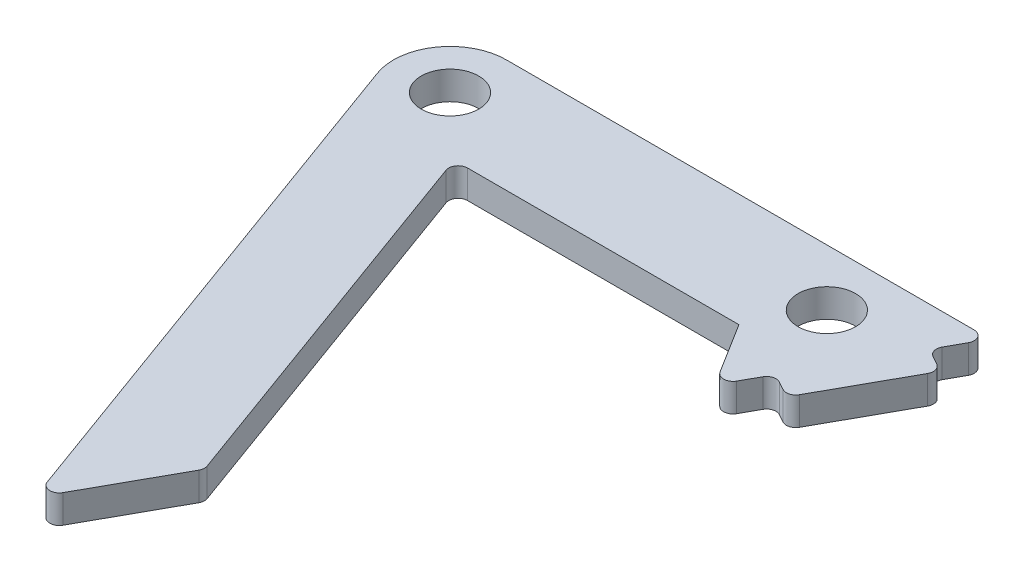
ISO-10303-21;
HEADER;
FILE_DESCRIPTION(('STEP AP214'),'2;1');
FILE_NAME('part.step','',(''),(''),'','','');
FILE_SCHEMA(('AUTOMOTIVE_DESIGN { 1 0 10303 214 1 1 1 1 }'));
ENDSEC;
DATA;
#1=APPLICATION_CONTEXT('core data for automotive mechanical design processes');
#2=APPLICATION_PROTOCOL_DEFINITION('international standard','automotive_design',2000,#1);
#3=PRODUCT_CONTEXT('',#1,'mechanical');
#4=PRODUCT('Part','Part','',(#3));
#5=PRODUCT_RELATED_PRODUCT_CATEGORY('part','',(#4));
#6=PRODUCT_DEFINITION_FORMATION('','',#4);
#7=PRODUCT_DEFINITION_CONTEXT('part definition',#1,'design');
#8=PRODUCT_DEFINITION('design','',#6,#7);
#9=PRODUCT_DEFINITION_SHAPE('','',#8);
#10=(LENGTH_UNIT() NAMED_UNIT(*) SI_UNIT(.MILLI.,.METRE.));
#11=(NAMED_UNIT(*) PLANE_ANGLE_UNIT() SI_UNIT($,.RADIAN.));
#12=(NAMED_UNIT(*) SI_UNIT($,.STERADIAN.) SOLID_ANGLE_UNIT());
#13=UNCERTAINTY_MEASURE_WITH_UNIT(LENGTH_MEASURE(1.E-05),#10,'distance_accuracy_value','');
#14=(GEOMETRIC_REPRESENTATION_CONTEXT(3) GLOBAL_UNCERTAINTY_ASSIGNED_CONTEXT((#13)) GLOBAL_UNIT_ASSIGNED_CONTEXT((#10,
#11,#12)) REPRESENTATION_CONTEXT('',''));
#15=CARTESIAN_POINT('',(0.,0.,0.));
#16=DIRECTION('',(0.,0.,1.));
#17=DIRECTION('',(1.,0.,0.));
#18=AXIS2_PLACEMENT_3D('',#15,#16,#17);
#19=CARTESIAN_POINT('',(0.,3.,0.));
#20=DIRECTION('',(0.,-1.,0.));
#21=DIRECTION('',(0.,0.,-1.));
#22=AXIS2_PLACEMENT_3D('',#19,#20,#21);
#23=CYLINDRICAL_SURFACE('',#22,6.);
#24=DIRECTION('',(0.,-1.,0.));
#25=VECTOR('',#24,1.);
#26=CARTESIAN_POINT('',(-5.63815572471545,3.,2.05212085995402));
#27=LINE('',#26,#25);
#28=CARTESIAN_POINT('',(-5.63815572471545,0.,2.05212085995402));
#29=VERTEX_POINT('',#28);
#30=CARTESIAN_POINT('',(-5.63815572471545,3.,2.05212085995402));
#31=VERTEX_POINT('',#30);
#32=EDGE_CURVE('E191',#29,#31,#27,.F.);
#33=ORIENTED_EDGE('',*,*,#32,.T.);
#34=CARTESIAN_POINT('',(0.,3.,0.));
#35=DIRECTION('',(0.,1.,0.));
#36=DIRECTION('',(0.,0.,1.));
#37=AXIS2_PLACEMENT_3D('',#34,#35,#36);
#38=CIRCLE('',#37,6.);
#39=CARTESIAN_POINT('',(0.,3.,-6.));
#40=VERTEX_POINT('',#39);
#41=EDGE_CURVE('E201',#40,#31,#38,.T.);
#42=ORIENTED_EDGE('',*,*,#41,.F.);
#43=DIRECTION('',(0.,-1.,0.));
#44=VECTOR('',#43,1.);
#45=CARTESIAN_POINT('',(0.,3.,-6.));
#46=LINE('',#45,#44);
#47=CARTESIAN_POINT('',(0.,0.,-6.));
#48=VERTEX_POINT('',#47);
#49=EDGE_CURVE('E239',#40,#48,#46,.T.);
#50=ORIENTED_EDGE('',*,*,#49,.T.);
#51=CARTESIAN_POINT('',(0.,0.,0.));
#52=DIRECTION('',(0.,1.,0.));
#53=DIRECTION('',(0.,0.,1.));
#54=AXIS2_PLACEMENT_3D('',#51,#52,#53);
#55=CIRCLE('',#54,6.);
#56=EDGE_CURVE('E203',#48,#29,#55,.T.);
#57=ORIENTED_EDGE('',*,*,#56,.T.);
#58=EDGE_LOOP('',(#33,#42,#50,#57));
#59=FACE_BOUND('',#58,.T.);
#60=ADVANCED_FACE('F43',(#59),#23,.T.);
#61=CARTESIAN_POINT('',(0.,3.,6.));
#62=DIRECTION('',(0.,0.,-1.));
#63=DIRECTION('',(-1.,0.,0.));
#64=AXIS2_PLACEMENT_3D('',#61,#62,#63);
#65=PLANE('',#64);
#66=DIRECTION('',(1.,0.,0.));
#67=VECTOR('',#66,1.);
#68=CARTESIAN_POINT('',(0.,3.,6.));
#69=LINE('',#68,#67);
#70=CARTESIAN_POINT('',(7.86868050224298,3.,6.));
#71=VERTEX_POINT('',#70);
#72=CARTESIAN_POINT('',(36.6741456912834,3.,6.));
#73=VERTEX_POINT('',#72);
#74=EDGE_CURVE('E211',#71,#73,#69,.T.);
#75=ORIENTED_EDGE('',*,*,#74,.F.);
#76=DIRECTION('',(0.,1.,0.));
#77=VECTOR('',#76,1.);
#78=CARTESIAN_POINT('',(7.86868050224298,0.,6.));
#79=LINE('',#78,#77);
#80=CARTESIAN_POINT('',(7.86868050224298,0.,6.));
#81=VERTEX_POINT('',#80);
#82=EDGE_CURVE('E271',#71,#81,#79,.F.);
#83=ORIENTED_EDGE('',*,*,#82,.T.);
#84=DIRECTION('',(1.,0.,0.));
#85=VECTOR('',#84,1.);
#86=CARTESIAN_POINT('',(0.,0.,6.));
#87=LINE('',#86,#85);
#88=CARTESIAN_POINT('',(36.6741456912834,0.,6.));
#89=VERTEX_POINT('',#88);
#90=EDGE_CURVE('E241',#81,#89,#87,.T.);
#91=ORIENTED_EDGE('',*,*,#90,.T.);
#92=DIRECTION('',(0.,-1.,0.));
#93=VECTOR('',#92,1.);
#94=CARTESIAN_POINT('',(36.6741456912834,3.,6.));
#95=LINE('',#94,#93);
#96=EDGE_CURVE('E262',#73,#89,#95,.T.);
#97=ORIENTED_EDGE('',*,*,#96,.F.);
#98=EDGE_LOOP('',(#75,#83,#91,#97));
#99=FACE_BOUND('',#98,.T.);
#100=ADVANCED_FACE('F424',(#99),#65,.F.);
#101=CARTESIAN_POINT('',(0.,3.,0.));
#102=DIRECTION('',(0.,1.,0.));
#103=DIRECTION('',(0.,0.,1.));
#104=AXIS2_PLACEMENT_3D('',#101,#102,#103);
#105=PLANE('',#104);
#106=DIRECTION('',(0.484809620246337,0.,-0.874619707139396));
#107=VECTOR('',#106,1.);
#108=CARTESIAN_POINT('',(12.6945672422889,3.,63.6989620506548));
#109=LINE('',#108,#107);
#110=CARTESIAN_POINT('',(16.2362573041486,3.,57.3095840446896));
#111=VERTEX_POINT('',#110);
#112=CARTESIAN_POINT('',(21.3752896731638,3.,48.0385242351006));
#113=VERTEX_POINT('',#112);
#114=EDGE_CURVE('E402',#111,#113,#109,.T.);
#115=ORIENTED_EDGE('',*,*,#114,.T.);
#116=CARTESIAN_POINT('',(20.5006699660244,3.,47.5537146148542));
#117=DIRECTION('',(0.,1.,0.));
#118=DIRECTION('',(0.,0.,1.));
#119=AXIS2_PLACEMENT_3D('',#116,#117,#118);
#120=CIRCLE('',#119,1.);
#121=CARTESIAN_POINT('',(21.4403625868103,3.,47.2116944715286));
#122=VERTEX_POINT('',#121);
#123=EDGE_CURVE('E297',#113,#122,#120,.T.);
#124=ORIENTED_EDGE('',*,*,#123,.T.);
#125=DIRECTION('',(-0.342020143325669,0.,-0.939692620785908));
#126=VECTOR('',#125,1.);
#127=CARTESIAN_POINT('',(27.2338705545627,3.,63.1292267923586));
#128=LINE('',#127,#126);
#129=CARTESIAN_POINT('',(6.92898788145707,3.,7.34202014332568));
#130=VERTEX_POINT('',#129);
#131=EDGE_CURVE('E204',#122,#130,#128,.T.);
#132=ORIENTED_EDGE('',*,*,#131,.T.);
#133=CARTESIAN_POINT('',(7.86868050224298,3.,7.));
#134=DIRECTION('',(0.,1.,0.));
#135=DIRECTION('',(0.,0.,1.));
#136=AXIS2_PLACEMENT_3D('',#133,#134,#135);
#137=CIRCLE('',#136,1.);
#138=EDGE_CURVE('E330',#130,#71,#137,.F.);
#139=ORIENTED_EDGE('',*,*,#138,.T.);
#140=ORIENTED_EDGE('',*,*,#74,.T.);
#141=DIRECTION('',(0.529919264233209,0.,0.848048096156423));
#142=VECTOR('',#141,1.);
#143=CARTESIAN_POINT('',(36.6741456912834,3.,6.));
#144=LINE('',#143,#142);
#145=CARTESIAN_POINT('',(40.0157187250126,3.,11.3476347071892));
#146=VERTEX_POINT('',#145);
#147=EDGE_CURVE('E214',#73,#146,#144,.T.);
#148=ORIENTED_EDGE('',*,*,#147,.T.);
#149=CARTESIAN_POINT('',(40.863766821169,3.,10.817715442956));
#150=DIRECTION('',(0.,1.,0.));
#151=DIRECTION('',(0.,0.,1.));
#152=AXIS2_PLACEMENT_3D('',#149,#150,#151);
#153=CIRCLE('',#152,1.);
#154=CARTESIAN_POINT('',(41.7383865283084,3.,11.3025250632023));
#155=VERTEX_POINT('',#154);
#156=EDGE_CURVE('E289',#146,#155,#153,.T.);
#157=ORIENTED_EDGE('',*,*,#156,.T.);
#158=DIRECTION('',(0.484809620246337,0.,-0.874619707139396));
#159=VECTOR('',#158,1.);
#160=CARTESIAN_POINT('',(40.9153431161217,3.,12.7873346834487));
#161=LINE('',#160,#159);
#162=CARTESIAN_POINT('',(42.7286706082514,3.,9.51600529170013));
#163=VERTEX_POINT('',#162);
#164=EDGE_CURVE('E224',#155,#163,#161,.T.);
#165=ORIENTED_EDGE('',*,*,#164,.T.);
#166=CARTESIAN_POINT('',(43.6032903153908,3.,10.0008149119465));
#167=DIRECTION('',(0.,1.,0.));
#168=DIRECTION('',(0.,0.,1.));
#169=AXIS2_PLACEMENT_3D('',#166,#167,#168);
#170=CIRCLE('',#169,1.);
#171=CARTESIAN_POINT('',(44.0880999356372,3.,9.12619520480707));
#172=VERTEX_POINT('',#171);
#173=EDGE_CURVE('E11',#163,#172,#170,.F.);
#174=ORIENTED_EDGE('',*,*,#173,.T.);
#175=DIRECTION('',(0.874619707139397,0.,0.484809620246335));
#176=VECTOR('',#175,1.);
#177=CARTESIAN_POINT('',(43.2134802284978,3.,8.64138558456073));
#178=LINE('',#177,#176);
#179=CARTESIAN_POINT('',(44.9627196427766,3.,9.61100482505341));
#180=VERTEX_POINT('',#179);
#181=EDGE_CURVE('E227',#172,#180,#178,.T.);
#182=ORIENTED_EDGE('',*,*,#181,.T.);
#183=CARTESIAN_POINT('',(45.4475292630229,3.,8.73638511791401));
#184=DIRECTION('',(0.,1.,0.));
#185=DIRECTION('',(0.,0.,1.));
#186=AXIS2_PLACEMENT_3D('',#183,#184,#185);
#187=CIRCLE('',#186,1.);
#188=CARTESIAN_POINT('',(46.3221489701623,3.,9.22119473816034));
#189=VERTEX_POINT('',#188);
#190=EDGE_CURVE('E292',#180,#189,#187,.T.);
#191=ORIENTED_EDGE('',*,*,#190,.T.);
#192=DIRECTION('',(0.484809620246334,0.,-0.874619707139397));
#193=VECTOR('',#192,1.);
#194=CARTESIAN_POINT('',(45.837339349916,3.,10.0958144452997));
#195=LINE('',#194,#193);
#196=CARTESIAN_POINT('',(51.1702451726256,3.,0.474997666766376));
#197=VERTEX_POINT('',#196);
#198=EDGE_CURVE('E230',#189,#197,#195,.T.);
#199=ORIENTED_EDGE('',*,*,#198,.T.);
#200=CARTESIAN_POINT('',(50.2956254654862,3.,-0.00981195347996168));
#201=DIRECTION('',(0.,1.,0.));
#202=DIRECTION('',(0.,0.,1.));
#203=AXIS2_PLACEMENT_3D('',#200,#201,#202);
#204=CIRCLE('',#203,1.);
#205=CARTESIAN_POINT('',(50.7804350857326,3.,-0.884431660619359));
#206=VERTEX_POINT('',#205);
#207=EDGE_CURVE('E294',#197,#206,#204,.T.);
#208=ORIENTED_EDGE('',*,*,#207,.T.);
#209=DIRECTION('',(-0.874619707139396,0.,-0.484809620246336));
#210=VECTOR('',#209,1.);
#211=CARTESIAN_POINT('',(51.655054792872,3.,-0.399622040373023));
#212=LINE('',#211,#210);
#213=CARTESIAN_POINT('',(49.9058153785932,3.,-1.3692412808657));
#214=VERTEX_POINT('',#213);
#215=EDGE_CURVE('E233',#206,#214,#212,.T.);
#216=ORIENTED_EDGE('',*,*,#215,.T.);
#217=CARTESIAN_POINT('',(50.3906249988395,3.,-2.24386098800509));
#218=DIRECTION('',(0.,1.,0.));
#219=DIRECTION('',(0.,0.,1.));
#220=AXIS2_PLACEMENT_3D('',#217,#218,#219);
#221=CIRCLE('',#220,1.);
#222=CARTESIAN_POINT('',(49.5160052917001,3.,-2.72867060825142));
#223=VERTEX_POINT('',#222);
#224=EDGE_CURVE('E336',#214,#223,#221,.F.);
#225=ORIENTED_EDGE('',*,*,#224,.T.);
#226=DIRECTION('',(0.484809620246333,0.,-0.874619707139398));
#227=VECTOR('',#226,1.);
#228=CARTESIAN_POINT('',(49.0311956714538,3.,-1.85405090111203));
#229=LINE('',#228,#227);
#230=CARTESIAN_POINT('',(50.5062893716431,3.,-4.51519037975367));
#231=VERTEX_POINT('',#230);
#232=EDGE_CURVE('E236',#223,#231,#229,.T.);
#233=ORIENTED_EDGE('',*,*,#232,.T.);
#234=CARTESIAN_POINT('',(49.6316696645037,3.,-5.));
#235=DIRECTION('',(0.,1.,0.));
#236=DIRECTION('',(0.,0.,1.));
#237=AXIS2_PLACEMENT_3D('',#234,#235,#236);
#238=CIRCLE('',#237,1.);
#239=CARTESIAN_POINT('',(49.6316696645037,3.,-6.));
#240=VERTEX_POINT('',#239);
#241=EDGE_CURVE('E66',#231,#240,#238,.T.);
#242=ORIENTED_EDGE('',*,*,#241,.T.);
#243=DIRECTION('',(-1.,0.,0.));
#244=VECTOR('',#243,1.);
#245=CARTESIAN_POINT('',(40.,3.,-6.));
#246=LINE('',#245,#244);
#247=EDGE_CURVE('E209',#240,#40,#246,.T.);
#248=ORIENTED_EDGE('',*,*,#247,.T.);
#249=ORIENTED_EDGE('',*,*,#41,.T.);
#250=DIRECTION('',(-0.342020143325669,0.,-0.939692620785908));
#251=VECTOR('',#250,1.);
#252=CARTESIAN_POINT('',(17.8369443467036,3.,66.5494282256153));
#253=LINE('',#252,#251);
#254=CARTESIAN_POINT('',(14.4219449762233,3.,57.1667945677689));
#255=VERTEX_POINT('',#254);
#256=EDGE_CURVE('E187',#255,#31,#253,.T.);
#257=ORIENTED_EDGE('',*,*,#256,.F.);
#258=CARTESIAN_POINT('',(15.3616375970092,3.,56.8247744244433));
#259=DIRECTION('',(0.,1.,0.));
#260=DIRECTION('',(0.,0.,1.));
#261=AXIS2_PLACEMENT_3D('',#258,#259,#260);
#262=CIRCLE('',#261,1.);
#263=EDGE_CURVE('E58',#255,#111,#262,.T.);
#264=ORIENTED_EDGE('',*,*,#263,.T.);
#265=EDGE_LOOP('',(#115,#124,#132,#139,#140,#148,#157,#165,#174,#182,#191,#199,#208,#216,#225,
#233,#242,#248,#249,#257,#264));
#266=FACE_BOUND('',#265,.T.);
#267=CARTESIAN_POINT('',(40.,3.,0.));
#268=DIRECTION('',(0.,1.,0.));
#269=DIRECTION('',(0.,0.,1.));
#270=AXIS2_PLACEMENT_3D('',#267,#268,#269);
#271=CIRCLE('',#270,3.05);
#272=CARTESIAN_POINT('',(40.,3.,3.05));
#273=VERTEX_POINT('',#272);
#274=EDGE_CURVE('E397',#273,#273,#271,.T.);
#275=ORIENTED_EDGE('',*,*,#274,.F.);
#276=EDGE_LOOP('',(#275));
#277=FACE_BOUND('',#276,.T.);
#278=CARTESIAN_POINT('',(0.,3.,0.));
#279=DIRECTION('',(0.,1.,0.));
#280=DIRECTION('',(0.,0.,1.));
#281=AXIS2_PLACEMENT_3D('',#278,#279,#280);
#282=CIRCLE('',#281,3.05);
#283=CARTESIAN_POINT('',(0.,3.,3.05));
#284=VERTEX_POINT('',#283);
#285=EDGE_CURVE('E242',#284,#284,#282,.T.);
#286=ORIENTED_EDGE('',*,*,#285,.F.);
#287=EDGE_LOOP('',(#286));
#288=FACE_BOUND('',#287,.T.);
#289=ADVANCED_FACE('F207',(#266,#277,#288),#105,.T.);
#290=CARTESIAN_POINT('',(0.,0.,0.));
#291=DIRECTION('',(0.,1.,0.));
#292=DIRECTION('',(0.,0.,1.));
#293=AXIS2_PLACEMENT_3D('',#290,#291,#292);
#294=PLANE('',#293);
#295=DIRECTION('',(-0.342020143325669,0.,-0.939692620785908));
#296=VECTOR('',#295,1.);
#297=CARTESIAN_POINT('',(27.2338705545627,0.,63.1292267923586));
#298=LINE('',#297,#296);
#299=CARTESIAN_POINT('',(21.4403625868103,0.,47.2116944715286));
#300=VERTEX_POINT('',#299);
#301=CARTESIAN_POINT('',(6.92898788145707,0.,7.34202014332568));
#302=VERTEX_POINT('',#301);
#303=EDGE_CURVE('E391',#300,#302,#298,.T.);
#304=ORIENTED_EDGE('',*,*,#303,.F.);
#305=CARTESIAN_POINT('',(20.5006699660244,0.,47.5537146148542));
#306=DIRECTION('',(0.,1.,0.));
#307=DIRECTION('',(0.,0.,1.));
#308=AXIS2_PLACEMENT_3D('',#305,#306,#307);
#309=CIRCLE('',#308,1.);
#310=CARTESIAN_POINT('',(21.3752896731638,0.,48.0385242351006));
#311=VERTEX_POINT('',#310);
#312=EDGE_CURVE('E283',#300,#311,#309,.F.);
#313=ORIENTED_EDGE('',*,*,#312,.T.);
#314=DIRECTION('',(-0.484809620246337,0.,0.874619707139396));
#315=VECTOR('',#314,1.);
#316=CARTESIAN_POINT('',(12.6945672422889,0.,63.6989620506548));
#317=LINE('',#316,#315);
#318=CARTESIAN_POINT('',(16.2362573041486,0.,57.3095840446896));
#319=VERTEX_POINT('',#318);
#320=EDGE_CURVE('E195',#311,#319,#317,.T.);
#321=ORIENTED_EDGE('',*,*,#320,.T.);
#322=CARTESIAN_POINT('',(15.3616375970092,0.,56.8247744244433));
#323=DIRECTION('',(0.,1.,0.));
#324=DIRECTION('',(0.,0.,1.));
#325=AXIS2_PLACEMENT_3D('',#322,#323,#324);
#326=CIRCLE('',#325,1.);
#327=CARTESIAN_POINT('',(14.4219449762233,0.,57.1667945677689));
#328=VERTEX_POINT('',#327);
#329=EDGE_CURVE('E281',#319,#328,#326,.F.);
#330=ORIENTED_EDGE('',*,*,#329,.T.);
#331=DIRECTION('',(-0.342020143325669,0.,-0.939692620785908));
#332=VECTOR('',#331,1.);
#333=CARTESIAN_POINT('',(17.8369443467036,0.,66.5494282256153));
#334=LINE('',#333,#332);
#335=EDGE_CURVE('E196',#328,#29,#334,.T.);
#336=ORIENTED_EDGE('',*,*,#335,.T.);
#337=ORIENTED_EDGE('',*,*,#56,.F.);
#338=DIRECTION('',(-1.,0.,0.));
#339=VECTOR('',#338,1.);
#340=CARTESIAN_POINT('',(0.,0.,-6.));
#341=LINE('',#340,#339);
#342=CARTESIAN_POINT('',(49.6316696645037,0.,-6.));
#343=VERTEX_POINT('',#342);
#344=EDGE_CURVE('E212',#343,#48,#341,.T.);
#345=ORIENTED_EDGE('',*,*,#344,.F.);
#346=CARTESIAN_POINT('',(49.6316696645037,0.,-5.));
#347=DIRECTION('',(0.,1.,0.));
#348=DIRECTION('',(0.,0.,1.));
#349=AXIS2_PLACEMENT_3D('',#346,#347,#348);
#350=CIRCLE('',#349,1.);
#351=CARTESIAN_POINT('',(50.5062893716431,0.,-4.51519037975367));
#352=VERTEX_POINT('',#351);
#353=EDGE_CURVE('E275',#343,#352,#350,.F.);
#354=ORIENTED_EDGE('',*,*,#353,.T.);
#355=DIRECTION('',(0.484809620246333,0.,-0.874619707139398));
#356=VECTOR('',#355,1.);
#357=CARTESIAN_POINT('',(49.0311956714538,0.,-1.85405090111203));
#358=LINE('',#357,#356);
#359=CARTESIAN_POINT('',(49.5160052917001,0.,-2.72867060825142));
#360=VERTEX_POINT('',#359);
#361=EDGE_CURVE('E216',#360,#352,#358,.T.);
#362=ORIENTED_EDGE('',*,*,#361,.F.);
#363=CARTESIAN_POINT('',(50.3906249988395,0.,-2.24386098800509));
#364=DIRECTION('',(0.,1.,0.));
#365=DIRECTION('',(0.,0.,1.));
#366=AXIS2_PLACEMENT_3D('',#363,#364,#365);
#367=CIRCLE('',#366,1.);
#368=CARTESIAN_POINT('',(49.9058153785932,0.,-1.3692412808657));
#369=VERTEX_POINT('',#368);
#370=EDGE_CURVE('E334',#360,#369,#367,.T.);
#371=ORIENTED_EDGE('',*,*,#370,.T.);
#372=DIRECTION('',(-0.874619707139396,0.,-0.484809620246336));
#373=VECTOR('',#372,1.);
#374=CARTESIAN_POINT('',(51.655054792872,0.,-0.399622040373023));
#375=LINE('',#374,#373);
#376=CARTESIAN_POINT('',(50.7804350857326,0.,-0.884431660619359));
#377=VERTEX_POINT('',#376);
#378=EDGE_CURVE('E256',#377,#369,#375,.T.);
#379=ORIENTED_EDGE('',*,*,#378,.F.);
#380=CARTESIAN_POINT('',(50.2956254654862,0.,-0.00981195347996168));
#381=DIRECTION('',(0.,1.,0.));
#382=DIRECTION('',(0.,0.,1.));
#383=AXIS2_PLACEMENT_3D('',#380,#381,#382);
#384=CIRCLE('',#383,1.);
#385=CARTESIAN_POINT('',(51.1702451726256,0.,0.474997666766376));
#386=VERTEX_POINT('',#385);
#387=EDGE_CURVE('E279',#377,#386,#384,.F.);
#388=ORIENTED_EDGE('',*,*,#387,.T.);
#389=DIRECTION('',(0.484809620246334,0.,-0.874619707139397));
#390=VECTOR('',#389,1.);
#391=CARTESIAN_POINT('',(45.837339349916,0.,10.0958144452997));
#392=LINE('',#391,#390);
#393=CARTESIAN_POINT('',(46.3221489701623,0.,9.22119473816034));
#394=VERTEX_POINT('',#393);
#395=EDGE_CURVE('E253',#394,#386,#392,.T.);
#396=ORIENTED_EDGE('',*,*,#395,.F.);
#397=CARTESIAN_POINT('',(45.4475292630229,0.,8.73638511791401));
#398=DIRECTION('',(0.,1.,0.));
#399=DIRECTION('',(0.,0.,1.));
#400=AXIS2_PLACEMENT_3D('',#397,#398,#399);
#401=CIRCLE('',#400,1.);
#402=CARTESIAN_POINT('',(44.9627196427766,0.,9.61100482505341));
#403=VERTEX_POINT('',#402);
#404=EDGE_CURVE('E277',#394,#403,#401,.F.);
#405=ORIENTED_EDGE('',*,*,#404,.T.);
#406=DIRECTION('',(0.874619707139397,0.,0.484809620246335));
#407=VECTOR('',#406,1.);
#408=CARTESIAN_POINT('',(43.2134802284978,0.,8.64138558456073));
#409=LINE('',#408,#407);
#410=CARTESIAN_POINT('',(44.0880999356372,0.,9.12619520480707));
#411=VERTEX_POINT('',#410);
#412=EDGE_CURVE('E250',#411,#403,#409,.T.);
#413=ORIENTED_EDGE('',*,*,#412,.F.);
#414=CARTESIAN_POINT('',(43.6032903153908,0.,10.0008149119465));
#415=DIRECTION('',(0.,1.,0.));
#416=DIRECTION('',(0.,0.,1.));
#417=AXIS2_PLACEMENT_3D('',#414,#415,#416);
#418=CIRCLE('',#417,1.);
#419=CARTESIAN_POINT('',(42.7286706082514,0.,9.51600529170013));
#420=VERTEX_POINT('',#419);
#421=EDGE_CURVE('E51',#411,#420,#418,.T.);
#422=ORIENTED_EDGE('',*,*,#421,.T.);
#423=DIRECTION('',(0.484809620246337,0.,-0.874619707139396));
#424=VECTOR('',#423,1.);
#425=CARTESIAN_POINT('',(40.9153431161217,0.,12.7873346834487));
#426=LINE('',#425,#424);
#427=CARTESIAN_POINT('',(41.7383865283084,0.,11.3025250632023));
#428=VERTEX_POINT('',#427);
#429=EDGE_CURVE('E247',#428,#420,#426,.T.);
#430=ORIENTED_EDGE('',*,*,#429,.F.);
#431=CARTESIAN_POINT('',(40.863766821169,0.,10.817715442956));
#432=DIRECTION('',(0.,1.,0.));
#433=DIRECTION('',(0.,0.,1.));
#434=AXIS2_PLACEMENT_3D('',#431,#432,#433);
#435=CIRCLE('',#434,1.);
#436=CARTESIAN_POINT('',(40.0157187250126,0.,11.3476347071892));
#437=VERTEX_POINT('',#436);
#438=EDGE_CURVE('E273',#428,#437,#435,.F.);
#439=ORIENTED_EDGE('',*,*,#438,.T.);
#440=DIRECTION('',(0.529919264233209,0.,0.848048096156423));
#441=VECTOR('',#440,1.);
#442=CARTESIAN_POINT('',(36.6741456912834,0.,6.));
#443=LINE('',#442,#441);
#444=EDGE_CURVE('E244',#89,#437,#443,.T.);
#445=ORIENTED_EDGE('',*,*,#444,.F.);
#446=ORIENTED_EDGE('',*,*,#90,.F.);
#447=CARTESIAN_POINT('',(7.86868050224298,0.,7.));
#448=DIRECTION('',(0.,1.,0.));
#449=DIRECTION('',(0.,0.,1.));
#450=AXIS2_PLACEMENT_3D('',#447,#448,#449);
#451=CIRCLE('',#450,1.);
#452=EDGE_CURVE('E332',#81,#302,#451,.T.);
#453=ORIENTED_EDGE('',*,*,#452,.T.);
#454=EDGE_LOOP('',(#304,#313,#321,#330,#336,#337,#345,#354,#362,#371,#379,#388,#396,#405,#413,
#422,#430,#439,#445,#446,#453));
#455=FACE_BOUND('',#454,.T.);
#456=CARTESIAN_POINT('',(0.,0.,0.));
#457=DIRECTION('',(0.,1.,0.));
#458=DIRECTION('',(0.,0.,1.));
#459=AXIS2_PLACEMENT_3D('',#456,#457,#458);
#460=CIRCLE('',#459,3.05);
#461=CARTESIAN_POINT('',(0.,0.,3.05));
#462=VERTEX_POINT('',#461);
#463=EDGE_CURVE('E219',#462,#462,#460,.T.);
#464=ORIENTED_EDGE('',*,*,#463,.T.);
#465=EDGE_LOOP('',(#464));
#466=FACE_BOUND('',#465,.T.);
#467=CARTESIAN_POINT('',(40.,0.,0.));
#468=DIRECTION('',(0.,1.,0.));
#469=DIRECTION('',(0.,0.,1.));
#470=AXIS2_PLACEMENT_3D('',#467,#468,#469);
#471=CIRCLE('',#470,3.05);
#472=CARTESIAN_POINT('',(40.,0.,3.05));
#473=VERTEX_POINT('',#472);
#474=EDGE_CURVE('E400',#473,#473,#471,.T.);
#475=ORIENTED_EDGE('',*,*,#474,.T.);
#476=EDGE_LOOP('',(#475));
#477=FACE_BOUND('',#476,.T.);
#478=ADVANCED_FACE('F341',(#455,#466,#477),#294,.F.);
#479=CARTESIAN_POINT('',(36.6741456912834,3.,6.));
#480=DIRECTION('',(0.848048096156423,0.,-0.529919264233209));
#481=DIRECTION('',(-0.529919264233209,0.,-0.848048096156424));
#482=AXIS2_PLACEMENT_3D('',#479,#480,#481);
#483=PLANE('',#482);
#484=ORIENTED_EDGE('',*,*,#444,.T.);
#485=DIRECTION('',(0.,-1.,0.));
#486=VECTOR('',#485,1.);
#487=CARTESIAN_POINT('',(40.0157187250126,3.,11.3476347071892));
#488=LINE('',#487,#486);
#489=EDGE_CURVE('E328',#437,#146,#488,.F.);
#490=ORIENTED_EDGE('',*,*,#489,.T.);
#491=ORIENTED_EDGE('',*,*,#147,.F.);
#492=ORIENTED_EDGE('',*,*,#96,.T.);
#493=EDGE_LOOP('',(#484,#490,#491,#492));
#494=FACE_BOUND('',#493,.T.);
#495=ADVANCED_FACE('F465',(#494),#483,.F.);
#496=CARTESIAN_POINT('',(40.9153431161217,3.,12.7873346834487));
#497=DIRECTION('',(-0.874619707139396,0.,-0.484809620246337));
#498=DIRECTION('',(-0.484809620246337,0.,0.874619707139396));
#499=AXIS2_PLACEMENT_3D('',#496,#497,#498);
#500=PLANE('',#499);
#501=ORIENTED_EDGE('',*,*,#429,.T.);
#502=DIRECTION('',(0.,-1.,0.));
#503=VECTOR('',#502,1.);
#504=CARTESIAN_POINT('',(42.7286706082514,3.,9.51600529170013));
#505=LINE('',#504,#503);
#506=EDGE_CURVE('E318',#420,#163,#505,.F.);
#507=ORIENTED_EDGE('',*,*,#506,.T.);
#508=ORIENTED_EDGE('',*,*,#164,.F.);
#509=DIRECTION('',(0.,-1.,0.));
#510=VECTOR('',#509,1.);
#511=CARTESIAN_POINT('',(41.7383865283084,3.,11.3025250632023));
#512=LINE('',#511,#510);
#513=EDGE_CURVE('E315',#155,#428,#512,.T.);
#514=ORIENTED_EDGE('',*,*,#513,.T.);
#515=EDGE_LOOP('',(#501,#507,#508,#514));
#516=FACE_BOUND('',#515,.T.);
#517=ADVANCED_FACE('F347',(#516),#500,.F.);
#518=CARTESIAN_POINT('',(43.2134802284978,3.,8.64138558456073));
#519=DIRECTION('',(0.484809620246335,0.,-0.874619707139397));
#520=DIRECTION('',(-0.874619707139397,0.,-0.484809620246335));
#521=AXIS2_PLACEMENT_3D('',#518,#519,#520);
#522=PLANE('',#521);
#523=ORIENTED_EDGE('',*,*,#181,.F.);
#524=DIRECTION('',(0.,-1.,0.));
#525=VECTOR('',#524,1.);
#526=CARTESIAN_POINT('',(44.0880999356372,0.,9.12619520480707));
#527=LINE('',#526,#525);
#528=EDGE_CURVE('E312',#172,#411,#527,.T.);
#529=ORIENTED_EDGE('',*,*,#528,.T.);
#530=ORIENTED_EDGE('',*,*,#412,.T.);
#531=DIRECTION('',(0.,-1.,0.));
#532=VECTOR('',#531,1.);
#533=CARTESIAN_POINT('',(44.9627196427766,3.,9.61100482505341));
#534=LINE('',#533,#532);
#535=EDGE_CURVE('E310',#403,#180,#534,.F.);
#536=ORIENTED_EDGE('',*,*,#535,.T.);
#537=EDGE_LOOP('',(#523,#529,#530,#536));
#538=FACE_BOUND('',#537,.T.);
#539=ADVANCED_FACE('F355',(#538),#522,.F.);
#540=CARTESIAN_POINT('',(45.837339349916,3.,10.0958144452997));
#541=DIRECTION('',(-0.874619707139397,0.,-0.484809620246334));
#542=DIRECTION('',(-0.484809620246334,0.,0.874619707139398));
#543=AXIS2_PLACEMENT_3D('',#540,#541,#542);
#544=PLANE('',#543);
#545=ORIENTED_EDGE('',*,*,#395,.T.);
#546=DIRECTION('',(0.,-1.,0.));
#547=VECTOR('',#546,1.);
#548=CARTESIAN_POINT('',(51.1702451726256,3.,0.474997666766373));
#549=LINE('',#548,#547);
#550=EDGE_CURVE('E323',#386,#197,#549,.F.);
#551=ORIENTED_EDGE('',*,*,#550,.T.);
#552=ORIENTED_EDGE('',*,*,#198,.F.);
#553=DIRECTION('',(0.,-1.,0.));
#554=VECTOR('',#553,1.);
#555=CARTESIAN_POINT('',(46.3221489701623,3.,9.22119473816034));
#556=LINE('',#555,#554);
#557=EDGE_CURVE('E320',#189,#394,#556,.T.);
#558=ORIENTED_EDGE('',*,*,#557,.T.);
#559=EDGE_LOOP('',(#545,#551,#552,#558));
#560=FACE_BOUND('',#559,.T.);
#561=ADVANCED_FACE('F363',(#560),#544,.F.);
#562=CARTESIAN_POINT('',(51.655054792872,3.,-0.399622040373023));
#563=DIRECTION('',(-0.484809620246336,0.,0.874619707139396));
#564=DIRECTION('',(0.874619707139396,0.,0.484809620246336));
#565=AXIS2_PLACEMENT_3D('',#562,#563,#564);
#566=PLANE('',#565);
#567=ORIENTED_EDGE('',*,*,#378,.T.);
#568=DIRECTION('',(0.,-1.,0.));
#569=VECTOR('',#568,1.);
#570=CARTESIAN_POINT('',(49.9058153785932,3.,-1.3692412808657));
#571=LINE('',#570,#569);
#572=EDGE_CURVE('E308',#369,#214,#571,.F.);
#573=ORIENTED_EDGE('',*,*,#572,.T.);
#574=ORIENTED_EDGE('',*,*,#215,.F.);
#575=DIRECTION('',(0.,-1.,0.));
#576=VECTOR('',#575,1.);
#577=CARTESIAN_POINT('',(50.7804350857326,3.,-0.884431660619359));
#578=LINE('',#577,#576);
#579=EDGE_CURVE('E305',#206,#377,#578,.T.);
#580=ORIENTED_EDGE('',*,*,#579,.T.);
#581=EDGE_LOOP('',(#567,#573,#574,#580));
#582=FACE_BOUND('',#581,.T.);
#583=ADVANCED_FACE('F372',(#582),#566,.F.);
#584=CARTESIAN_POINT('',(49.0311956714538,3.,-1.85405090111203));
#585=DIRECTION('',(-0.874619707139398,0.,-0.484809620246333));
#586=DIRECTION('',(-0.484809620246333,0.,0.874619707139398));
#587=AXIS2_PLACEMENT_3D('',#584,#585,#586);
#588=PLANE('',#587);
#589=ORIENTED_EDGE('',*,*,#232,.F.);
#590=DIRECTION('',(0.,-1.,0.));
#591=VECTOR('',#590,1.);
#592=CARTESIAN_POINT('',(49.5160052917001,0.,-2.72867060825142));
#593=LINE('',#592,#591);
#594=EDGE_CURVE('E302',#223,#360,#593,.T.);
#595=ORIENTED_EDGE('',*,*,#594,.T.);
#596=ORIENTED_EDGE('',*,*,#361,.T.);
#597=DIRECTION('',(0.,-1.,0.));
#598=VECTOR('',#597,1.);
#599=CARTESIAN_POINT('',(50.5062893716431,3.,-4.51519037975367));
#600=LINE('',#599,#598);
#601=EDGE_CURVE('E300',#352,#231,#600,.F.);
#602=ORIENTED_EDGE('',*,*,#601,.T.);
#603=EDGE_LOOP('',(#589,#595,#596,#602));
#604=FACE_BOUND('',#603,.T.);
#605=ADVANCED_FACE('F380',(#604),#588,.F.);
#606=CARTESIAN_POINT('',(0.,3.,-6.));
#607=DIRECTION('',(0.,0.,1.));
#608=DIRECTION('',(1.,0.,0.));
#609=AXIS2_PLACEMENT_3D('',#606,#607,#608);
#610=PLANE('',#609);
#611=ORIENTED_EDGE('',*,*,#247,.F.);
#612=DIRECTION('',(0.,-1.,0.));
#613=VECTOR('',#612,1.);
#614=CARTESIAN_POINT('',(49.6316696645037,3.,-6.));
#615=LINE('',#614,#613);
#616=EDGE_CURVE('E325',#240,#343,#615,.T.);
#617=ORIENTED_EDGE('',*,*,#616,.T.);
#618=ORIENTED_EDGE('',*,*,#344,.T.);
#619=ORIENTED_EDGE('',*,*,#49,.F.);
#620=EDGE_LOOP('',(#611,#617,#618,#619));
#621=FACE_BOUND('',#620,.T.);
#622=ADVANCED_FACE('F388',(#621),#610,.F.);
#623=CARTESIAN_POINT('',(0.,3.,0.));
#624=DIRECTION('',(0.,-1.,0.));
#625=DIRECTION('',(0.,0.,-1.));
#626=AXIS2_PLACEMENT_3D('',#623,#624,#625);
#627=CYLINDRICAL_SURFACE('',#626,3.05);
#628=ORIENTED_EDGE('',*,*,#285,.T.);
#629=EDGE_LOOP('',(#628));
#630=FACE_BOUND('',#629,.T.);
#631=ORIENTED_EDGE('',*,*,#463,.F.);
#632=EDGE_LOOP('',(#631));
#633=FACE_BOUND('',#632,.T.);
#634=ADVANCED_FACE('F410',(#630,#633),#627,.F.);
#635=CARTESIAN_POINT('',(40.,3.,0.));
#636=DIRECTION('',(0.,-1.,0.));
#637=DIRECTION('',(0.,0.,-1.));
#638=AXIS2_PLACEMENT_3D('',#635,#636,#637);
#639=CYLINDRICAL_SURFACE('',#638,3.05);
#640=ORIENTED_EDGE('',*,*,#274,.T.);
#641=EDGE_LOOP('',(#640));
#642=FACE_BOUND('',#641,.T.);
#643=ORIENTED_EDGE('',*,*,#474,.F.);
#644=EDGE_LOOP('',(#643));
#645=FACE_BOUND('',#644,.T.);
#646=ADVANCED_FACE('F412',(#642,#645),#639,.F.);
#647=CARTESIAN_POINT('',(27.2338705545627,3.,63.1292267923586));
#648=DIRECTION('',(-0.939692620785908,0.,0.342020143325669));
#649=DIRECTION('',(0.342020143325669,0.,0.939692620785908));
#650=AXIS2_PLACEMENT_3D('',#647,#648,#649);
#651=PLANE('',#650);
#652=ORIENTED_EDGE('',*,*,#303,.T.);
#653=DIRECTION('',(0.,1.,0.));
#654=VECTOR('',#653,1.);
#655=CARTESIAN_POINT('',(6.92898788145707,3.,7.34202014332567));
#656=LINE('',#655,#654);
#657=EDGE_CURVE('E268',#302,#130,#656,.T.);
#658=ORIENTED_EDGE('',*,*,#657,.T.);
#659=ORIENTED_EDGE('',*,*,#131,.F.);
#660=DIRECTION('',(0.,-1.,0.));
#661=VECTOR('',#660,1.);
#662=CARTESIAN_POINT('',(21.4403625868103,3.,47.2116944715286));
#663=LINE('',#662,#661);
#664=EDGE_CURVE('E265',#122,#300,#663,.T.);
#665=ORIENTED_EDGE('',*,*,#664,.T.);
#666=EDGE_LOOP('',(#652,#658,#659,#665));
#667=FACE_BOUND('',#666,.T.);
#668=ADVANCED_FACE('F417',(#667),#651,.F.);
#669=CARTESIAN_POINT('',(17.8369443467036,3.,66.5494282256153));
#670=DIRECTION('',(0.939692620785908,0.,-0.342020143325669));
#671=DIRECTION('',(-0.342020143325669,0.,-0.939692620785908));
#672=AXIS2_PLACEMENT_3D('',#669,#670,#671);
#673=PLANE('',#672);
#674=ORIENTED_EDGE('',*,*,#335,.F.);
#675=DIRECTION('',(0.,1.,0.));
#676=VECTOR('',#675,1.);
#677=CARTESIAN_POINT('',(14.4219449762233,3.,57.1667945677689));
#678=LINE('',#677,#676);
#679=EDGE_CURVE('E193',#328,#255,#678,.T.);
#680=ORIENTED_EDGE('',*,*,#679,.T.);
#681=ORIENTED_EDGE('',*,*,#256,.T.);
#682=ORIENTED_EDGE('',*,*,#32,.F.);
#683=EDGE_LOOP('',(#674,#680,#681,#682));
#684=FACE_BOUND('',#683,.T.);
#685=ADVANCED_FACE('F190',(#684),#673,.F.);
#686=CARTESIAN_POINT('',(40.9153431161217,3.,12.7873346834487));
#687=DIRECTION('',(-0.874619707139396,0.,-0.484809620246337));
#688=DIRECTION('',(-0.484809620246337,0.,0.874619707139396));
#689=AXIS2_PLACEMENT_3D('',#686,#687,#688);
#690=PLANE('',#689);
#691=ORIENTED_EDGE('',*,*,#320,.F.);
#692=DIRECTION('',(0.,-1.,0.));
#693=VECTOR('',#692,1.);
#694=CARTESIAN_POINT('',(21.3752896731638,3.,48.0385242351006));
#695=LINE('',#694,#693);
#696=EDGE_CURVE('E287',#311,#113,#695,.F.);
#697=ORIENTED_EDGE('',*,*,#696,.T.);
#698=ORIENTED_EDGE('',*,*,#114,.F.);
#699=DIRECTION('',(0.,1.,0.));
#700=VECTOR('',#699,1.);
#701=CARTESIAN_POINT('',(16.2362573041486,3.,57.3095840446896));
#702=LINE('',#701,#700);
#703=EDGE_CURVE('E285',#111,#319,#702,.F.);
#704=ORIENTED_EDGE('',*,*,#703,.T.);
#705=EDGE_LOOP('',(#691,#697,#698,#704));
#706=FACE_BOUND('',#705,.T.);
#707=ADVANCED_FACE('F437',(#706),#690,.F.);
#708=CARTESIAN_POINT('',(7.86868050224298,3.,7.));
#709=DIRECTION('',(0.,-1.,0.));
#710=DIRECTION('',(0.,0.,-1.));
#711=AXIS2_PLACEMENT_3D('',#708,#709,#710);
#712=CYLINDRICAL_SURFACE('',#711,1.);
#713=ORIENTED_EDGE('',*,*,#452,.F.);
#714=ORIENTED_EDGE('',*,*,#82,.F.);
#715=ORIENTED_EDGE('',*,*,#138,.F.);
#716=ORIENTED_EDGE('',*,*,#657,.F.);
#717=EDGE_LOOP('',(#713,#714,#715,#716));
#718=FACE_BOUND('',#717,.T.);
#719=ADVANCED_FACE('F433',(#718),#712,.F.);
#720=CARTESIAN_POINT('',(20.5006699660244,3.,47.5537146148542));
#721=DIRECTION('',(0.,-1.,0.));
#722=DIRECTION('',(0.,0.,-1.));
#723=AXIS2_PLACEMENT_3D('',#720,#721,#722);
#724=CYLINDRICAL_SURFACE('',#723,1.);
#725=ORIENTED_EDGE('',*,*,#123,.F.);
#726=ORIENTED_EDGE('',*,*,#696,.F.);
#727=ORIENTED_EDGE('',*,*,#312,.F.);
#728=ORIENTED_EDGE('',*,*,#664,.F.);
#729=EDGE_LOOP('',(#725,#726,#727,#728));
#730=FACE_BOUND('',#729,.T.);
#731=ADVANCED_FACE('F436',(#730),#724,.T.);
#732=CARTESIAN_POINT('',(15.3616375970092,3.,56.8247744244433));
#733=DIRECTION('',(0.,1.,0.));
#734=DIRECTION('',(0.,0.,1.));
#735=AXIS2_PLACEMENT_3D('',#732,#733,#734);
#736=CYLINDRICAL_SURFACE('',#735,1.);
#737=ORIENTED_EDGE('',*,*,#329,.F.);
#738=ORIENTED_EDGE('',*,*,#703,.F.);
#739=ORIENTED_EDGE('',*,*,#263,.F.);
#740=ORIENTED_EDGE('',*,*,#679,.F.);
#741=EDGE_LOOP('',(#737,#738,#739,#740));
#742=FACE_BOUND('',#741,.T.);
#743=ADVANCED_FACE('F441',(#742),#736,.T.);
#744=CARTESIAN_POINT('',(50.3906249988395,3.,-2.24386098800509));
#745=DIRECTION('',(0.,1.,0.));
#746=DIRECTION('',(0.,0.,1.));
#747=AXIS2_PLACEMENT_3D('',#744,#745,#746);
#748=CYLINDRICAL_SURFACE('',#747,1.);
#749=ORIENTED_EDGE('',*,*,#224,.F.);
#750=ORIENTED_EDGE('',*,*,#572,.F.);
#751=ORIENTED_EDGE('',*,*,#370,.F.);
#752=ORIENTED_EDGE('',*,*,#594,.F.);
#753=EDGE_LOOP('',(#749,#750,#751,#752));
#754=FACE_BOUND('',#753,.T.);
#755=ADVANCED_FACE('F376',(#754),#748,.F.);
#756=CARTESIAN_POINT('',(43.6032903153908,3.,10.0008149119465));
#757=DIRECTION('',(0.,1.,0.));
#758=DIRECTION('',(0.,0.,1.));
#759=AXIS2_PLACEMENT_3D('',#756,#757,#758);
#760=CYLINDRICAL_SURFACE('',#759,1.);
#761=ORIENTED_EDGE('',*,*,#173,.F.);
#762=ORIENTED_EDGE('',*,*,#506,.F.);
#763=ORIENTED_EDGE('',*,*,#421,.F.);
#764=ORIENTED_EDGE('',*,*,#528,.F.);
#765=EDGE_LOOP('',(#761,#762,#763,#764));
#766=FACE_BOUND('',#765,.T.);
#767=ADVANCED_FACE('F351',(#766),#760,.F.);
#768=CARTESIAN_POINT('',(50.2956254654862,3.,-0.00981195347996168));
#769=DIRECTION('',(0.,-1.,0.));
#770=DIRECTION('',(0.,0.,-1.));
#771=AXIS2_PLACEMENT_3D('',#768,#769,#770);
#772=CYLINDRICAL_SURFACE('',#771,1.);
#773=ORIENTED_EDGE('',*,*,#207,.F.);
#774=ORIENTED_EDGE('',*,*,#550,.F.);
#775=ORIENTED_EDGE('',*,*,#387,.F.);
#776=ORIENTED_EDGE('',*,*,#579,.F.);
#777=EDGE_LOOP('',(#773,#774,#775,#776));
#778=FACE_BOUND('',#777,.T.);
#779=ADVANCED_FACE('F367',(#778),#772,.T.);
#780=CARTESIAN_POINT('',(45.4475292630229,3.,8.73638511791401));
#781=DIRECTION('',(0.,-1.,0.));
#782=DIRECTION('',(0.,0.,-1.));
#783=AXIS2_PLACEMENT_3D('',#780,#781,#782);
#784=CYLINDRICAL_SURFACE('',#783,1.);
#785=ORIENTED_EDGE('',*,*,#190,.F.);
#786=ORIENTED_EDGE('',*,*,#535,.F.);
#787=ORIENTED_EDGE('',*,*,#404,.F.);
#788=ORIENTED_EDGE('',*,*,#557,.F.);
#789=EDGE_LOOP('',(#785,#786,#787,#788));
#790=FACE_BOUND('',#789,.T.);
#791=ADVANCED_FACE('F358',(#790),#784,.T.);
#792=CARTESIAN_POINT('',(49.6316696645037,3.,-5.));
#793=DIRECTION('',(0.,-1.,0.));
#794=DIRECTION('',(0.,0.,-1.));
#795=AXIS2_PLACEMENT_3D('',#792,#793,#794);
#796=CYLINDRICAL_SURFACE('',#795,1.);
#797=ORIENTED_EDGE('',*,*,#241,.F.);
#798=ORIENTED_EDGE('',*,*,#601,.F.);
#799=ORIENTED_EDGE('',*,*,#353,.F.);
#800=ORIENTED_EDGE('',*,*,#616,.F.);
#801=EDGE_LOOP('',(#797,#798,#799,#800));
#802=FACE_BOUND('',#801,.T.);
#803=ADVANCED_FACE('F384',(#802),#796,.T.);
#804=CARTESIAN_POINT('',(40.863766821169,3.,10.817715442956));
#805=DIRECTION('',(0.,-1.,0.));
#806=DIRECTION('',(0.,0.,-1.));
#807=AXIS2_PLACEMENT_3D('',#804,#805,#806);
#808=CYLINDRICAL_SURFACE('',#807,1.);
#809=ORIENTED_EDGE('',*,*,#156,.F.);
#810=ORIENTED_EDGE('',*,*,#489,.F.);
#811=ORIENTED_EDGE('',*,*,#438,.F.);
#812=ORIENTED_EDGE('',*,*,#513,.F.);
#813=EDGE_LOOP('',(#809,#810,#811,#812));
#814=FACE_BOUND('',#813,.T.);
#815=ADVANCED_FACE('F45',(#814),#808,.T.);
#816=CLOSED_SHELL('',(#60,#100,#289,#478,#495,#517,#539,#561,#583,#605,#622,#634,#646,#668,#685,
#707,#719,#731,#743,#755,#767,#779,#791,#803,#815));
#817=MANIFOLD_SOLID_BREP('B2',#816);
#818=ADVANCED_BREP_SHAPE_REPRESENTATION('',(#18,#817),#14);
#819=SHAPE_DEFINITION_REPRESENTATION(#9,#818);
ENDSEC;
END-ISO-10303-21;
